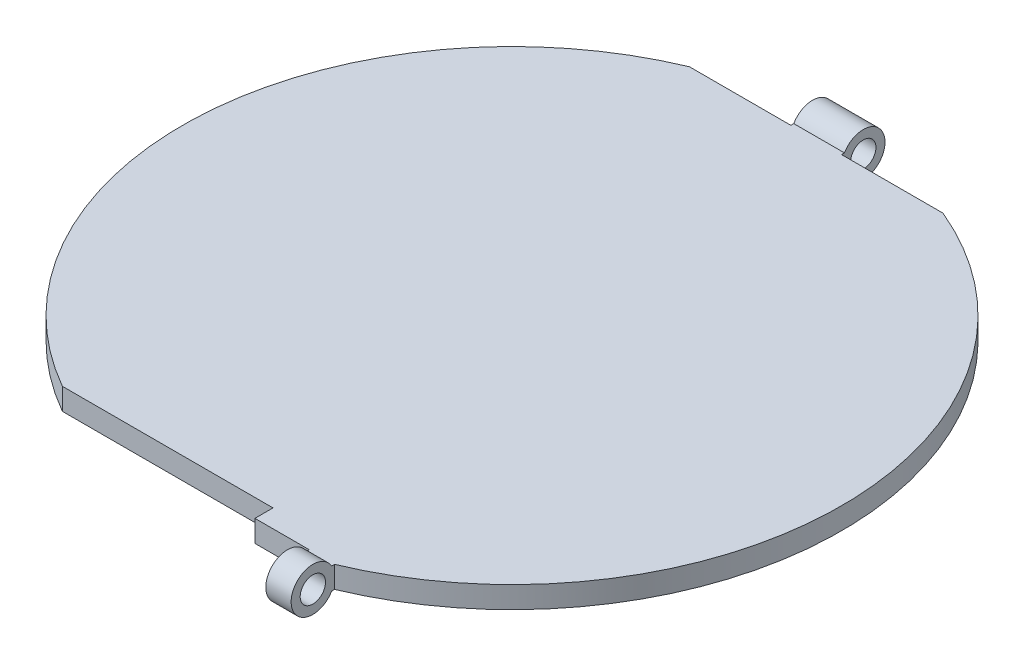
ISO-10303-21;
HEADER;
FILE_DESCRIPTION(('STEP AP214'),'2;1');
FILE_NAME('part.step','',(''),(''),'','','');
FILE_SCHEMA(('AUTOMOTIVE_DESIGN { 1 0 10303 214 1 1 1 1 }'));
ENDSEC;
DATA;
#1=APPLICATION_CONTEXT('core data for automotive mechanical design processes');
#2=APPLICATION_PROTOCOL_DEFINITION('international standard','automotive_design',2000,#1);
#3=PRODUCT_CONTEXT('',#1,'mechanical');
#4=PRODUCT('Part','Part','',(#3));
#5=PRODUCT_RELATED_PRODUCT_CATEGORY('part','',(#4));
#6=PRODUCT_DEFINITION_FORMATION('','',#4);
#7=PRODUCT_DEFINITION_CONTEXT('part definition',#1,'design');
#8=PRODUCT_DEFINITION('design','',#6,#7);
#9=PRODUCT_DEFINITION_SHAPE('','',#8);
#10=(LENGTH_UNIT() NAMED_UNIT(*) SI_UNIT(.MILLI.,.METRE.));
#11=(NAMED_UNIT(*) PLANE_ANGLE_UNIT() SI_UNIT($,.RADIAN.));
#12=(NAMED_UNIT(*) SI_UNIT($,.STERADIAN.) SOLID_ANGLE_UNIT());
#13=UNCERTAINTY_MEASURE_WITH_UNIT(LENGTH_MEASURE(1.E-05),#10,'distance_accuracy_value','');
#14=(GEOMETRIC_REPRESENTATION_CONTEXT(3) GLOBAL_UNCERTAINTY_ASSIGNED_CONTEXT((#13)) GLOBAL_UNIT_ASSIGNED_CONTEXT((#10,
#11,#12)) REPRESENTATION_CONTEXT('',''));
#15=CARTESIAN_POINT('',(0.,0.,0.));
#16=DIRECTION('',(0.,0.,1.));
#17=DIRECTION('',(1.,0.,0.));
#18=AXIS2_PLACEMENT_3D('',#15,#16,#17);
#19=CARTESIAN_POINT('',(0.,3.,0.));
#20=DIRECTION('',(0.,-1.,0.));
#21=DIRECTION('',(0.,0.,-1.));
#22=AXIS2_PLACEMENT_3D('',#19,#20,#21);
#23=CYLINDRICAL_SURFACE('',#22,45.5);
#24=DIRECTION('',(0.,-1.,0.));
#25=VECTOR('',#24,1.);
#26=CARTESIAN_POINT('',(-22.5831795812724,3.,39.5));
#27=LINE('',#26,#25);
#28=CARTESIAN_POINT('',(-22.5831795812724,0.,39.5));
#29=VERTEX_POINT('',#28);
#30=CARTESIAN_POINT('',(-22.5831795812724,3.,39.5));
#31=VERTEX_POINT('',#30);
#32=EDGE_CURVE('E51',#29,#31,#27,.F.);
#33=ORIENTED_EDGE('',*,*,#32,.T.);
#34=CARTESIAN_POINT('',(0.,3.,0.));
#35=DIRECTION('',(0.,1.,0.));
#36=DIRECTION('',(0.,0.,1.));
#37=AXIS2_PLACEMENT_3D('',#34,#35,#36);
#38=CIRCLE('',#37,45.5);
#39=CARTESIAN_POINT('',(-17.5,3.,-42.));
#40=VERTEX_POINT('',#39);
#41=EDGE_CURVE('E143',#40,#31,#38,.T.);
#42=ORIENTED_EDGE('',*,*,#41,.F.);
#43=DIRECTION('',(0.,-1.,0.));
#44=VECTOR('',#43,1.);
#45=CARTESIAN_POINT('',(-17.5,3.,-42.));
#46=LINE('',#45,#44);
#47=CARTESIAN_POINT('',(-17.5,0.,-42.));
#48=VERTEX_POINT('',#47);
#49=EDGE_CURVE('E164',#40,#48,#46,.T.);
#50=ORIENTED_EDGE('',*,*,#49,.T.);
#51=CARTESIAN_POINT('',(0.,0.,0.));
#52=DIRECTION('',(0.,1.,0.));
#53=DIRECTION('',(0.,0.,1.));
#54=AXIS2_PLACEMENT_3D('',#51,#52,#53);
#55=CIRCLE('',#54,45.5);
#56=EDGE_CURVE('E145',#48,#29,#55,.T.);
#57=ORIENTED_EDGE('',*,*,#56,.T.);
#58=EDGE_LOOP('',(#33,#42,#50,#57));
#59=FACE_BOUND('',#58,.T.);
#60=ADVANCED_FACE('F37',(#59),#23,.T.);
#61=CARTESIAN_POINT('',(-17.5,3.,42.));
#62=DIRECTION('',(0.,0.,-1.));
#63=DIRECTION('',(-1.,0.,0.));
#64=AXIS2_PLACEMENT_3D('',#61,#62,#63);
#65=PLANE('',#64);
#66=DIRECTION('',(0.,1.,0.));
#67=VECTOR('',#66,1.);
#68=CARTESIAN_POINT('',(6.5,3.,42.));
#69=LINE('',#68,#67);
#70=CARTESIAN_POINT('',(6.5,0.,42.));
#71=VERTEX_POINT('',#70);
#72=CARTESIAN_POINT('',(6.5,3.,42.));
#73=VERTEX_POINT('',#72);
#74=EDGE_CURVE('E137',#71,#73,#69,.T.);
#75=ORIENTED_EDGE('',*,*,#74,.F.);
#76=DIRECTION('',(1.,0.,0.));
#77=VECTOR('',#76,1.);
#78=CARTESIAN_POINT('',(-17.5,0.,42.));
#79=LINE('',#78,#77);
#80=CARTESIAN_POINT('',(14.,0.,42.));
#81=VERTEX_POINT('',#80);
#82=EDGE_CURVE('E166',#71,#81,#79,.T.);
#83=ORIENTED_EDGE('',*,*,#82,.T.);
#84=DIRECTION('',(0.,-1.,0.));
#85=VECTOR('',#84,1.);
#86=CARTESIAN_POINT('',(14.,6.5,42.));
#87=LINE('',#86,#85);
#88=CARTESIAN_POINT('',(14.,3.,42.));
#89=VERTEX_POINT('',#88);
#90=EDGE_CURVE('E182',#89,#81,#87,.T.);
#91=ORIENTED_EDGE('',*,*,#90,.F.);
#92=DIRECTION('',(1.,0.,0.));
#93=VECTOR('',#92,1.);
#94=CARTESIAN_POINT('',(-17.5,3.,42.));
#95=LINE('',#94,#93);
#96=EDGE_CURVE('E150',#73,#89,#95,.T.);
#97=ORIENTED_EDGE('',*,*,#96,.F.);
#98=EDGE_LOOP('',(#75,#83,#91,#97));
#99=FACE_BOUND('',#98,.T.);
#100=ADVANCED_FACE('F203',(#99),#65,.F.);
#101=CARTESIAN_POINT('',(0.,3.,0.));
#102=DIRECTION('',(0.,1.,0.));
#103=DIRECTION('',(0.,0.,1.));
#104=AXIS2_PLACEMENT_3D('',#101,#102,#103);
#105=PLANE('',#104);
#106=DIRECTION('',(1.,0.,0.));
#107=VECTOR('',#106,1.);
#108=CARTESIAN_POINT('',(0.,3.,39.5));
#109=LINE('',#108,#107);
#110=CARTESIAN_POINT('',(6.5,3.,39.5));
#111=VERTEX_POINT('',#110);
#112=EDGE_CURVE('E130',#31,#111,#109,.T.);
#113=ORIENTED_EDGE('',*,*,#112,.T.);
#114=DIRECTION('',(0.,0.,1.));
#115=VECTOR('',#114,1.);
#116=CARTESIAN_POINT('',(6.5,3.,0.));
#117=LINE('',#116,#115);
#118=EDGE_CURVE('E193',#111,#73,#117,.T.);
#119=ORIENTED_EDGE('',*,*,#118,.T.);
#120=ORIENTED_EDGE('',*,*,#96,.T.);
#121=DIRECTION('',(0.,0.,1.));
#122=VECTOR('',#121,1.);
#123=CARTESIAN_POINT('',(14.,3.,0.));
#124=LINE('',#123,#122);
#125=CARTESIAN_POINT('',(14.,3.,42.4019237886467));
#126=VERTEX_POINT('',#125);
#127=EDGE_CURVE('E211',#89,#126,#124,.T.);
#128=ORIENTED_EDGE('',*,*,#127,.T.);
#129=DIRECTION('',(1.,0.,0.));
#130=VECTOR('',#129,1.);
#131=CARTESIAN_POINT('',(-10.,3.,42.4019237886467));
#132=LINE('',#131,#130);
#133=CARTESIAN_POINT('',(17.5,3.,42.4019237886467));
#134=VERTEX_POINT('',#133);
#135=EDGE_CURVE('E158',#126,#134,#132,.T.);
#136=ORIENTED_EDGE('',*,*,#135,.T.);
#137=DIRECTION('',(0.,0.,1.));
#138=VECTOR('',#137,1.);
#139=CARTESIAN_POINT('',(17.5,3.,42.));
#140=LINE('',#139,#138);
#141=CARTESIAN_POINT('',(17.5,3.,42.));
#142=VERTEX_POINT('',#141);
#143=EDGE_CURVE('E229',#142,#134,#140,.T.);
#144=ORIENTED_EDGE('',*,*,#143,.F.);
#145=CARTESIAN_POINT('',(0.,3.,0.));
#146=DIRECTION('',(0.,1.,0.));
#147=DIRECTION('',(0.,0.,1.));
#148=AXIS2_PLACEMENT_3D('',#145,#146,#147);
#149=CIRCLE('',#148,45.5);
#150=CARTESIAN_POINT('',(17.5,3.,-42.));
#151=VERTEX_POINT('',#150);
#152=EDGE_CURVE('E153',#142,#151,#149,.T.);
#153=ORIENTED_EDGE('',*,*,#152,.T.);
#154=DIRECTION('',(1.,0.,0.));
#155=VECTOR('',#154,1.);
#156=CARTESIAN_POINT('',(0.,3.,-42.));
#157=LINE('',#156,#155);
#158=CARTESIAN_POINT('',(3.5,3.,-42.));
#159=VERTEX_POINT('',#158);
#160=EDGE_CURVE('E468',#159,#151,#157,.T.);
#161=ORIENTED_EDGE('',*,*,#160,.F.);
#162=DIRECTION('',(0.,0.,-1.));
#163=VECTOR('',#162,1.);
#164=CARTESIAN_POINT('',(3.5,3.,0.));
#165=LINE('',#164,#163);
#166=CARTESIAN_POINT('',(3.5,3.,-42.4019237886467));
#167=VERTEX_POINT('',#166);
#168=EDGE_CURVE('E457',#159,#167,#165,.T.);
#169=ORIENTED_EDGE('',*,*,#168,.T.);
#170=DIRECTION('',(1.,0.,0.));
#171=VECTOR('',#170,1.);
#172=CARTESIAN_POINT('',(-10.,3.,-42.4019237886467));
#173=LINE('',#172,#171);
#174=CARTESIAN_POINT('',(-3.5,3.,-42.4019237886467));
#175=VERTEX_POINT('',#174);
#176=EDGE_CURVE('E221',#175,#167,#173,.T.);
#177=ORIENTED_EDGE('',*,*,#176,.F.);
#178=DIRECTION('',(0.,0.,1.));
#179=VECTOR('',#178,1.);
#180=CARTESIAN_POINT('',(-3.5,3.,0.));
#181=LINE('',#180,#179);
#182=CARTESIAN_POINT('',(-3.5,3.,-42.));
#183=VERTEX_POINT('',#182);
#184=EDGE_CURVE('E59',#175,#183,#181,.T.);
#185=ORIENTED_EDGE('',*,*,#184,.T.);
#186=DIRECTION('',(-1.,0.,0.));
#187=VECTOR('',#186,1.);
#188=CARTESIAN_POINT('',(-17.5,3.,-42.));
#189=LINE('',#188,#187);
#190=EDGE_CURVE('E148',#183,#40,#189,.T.);
#191=ORIENTED_EDGE('',*,*,#190,.T.);
#192=ORIENTED_EDGE('',*,*,#41,.T.);
#193=EDGE_LOOP('',(#113,#119,#120,#128,#136,#144,#153,#161,#169,#177,#185,#191,#192));
#194=FACE_BOUND('',#193,.T.);
#195=ADVANCED_FACE('F147',(#194),#105,.T.);
#196=CARTESIAN_POINT('',(0.,0.,0.));
#197=DIRECTION('',(0.,1.,0.));
#198=DIRECTION('',(0.,0.,1.));
#199=AXIS2_PLACEMENT_3D('',#196,#197,#198);
#200=PLANE('',#199);
#201=DIRECTION('',(0.,0.,1.));
#202=VECTOR('',#201,1.);
#203=CARTESIAN_POINT('',(6.5,0.,0.));
#204=LINE('',#203,#202);
#205=CARTESIAN_POINT('',(6.5,0.,39.5));
#206=VERTEX_POINT('',#205);
#207=EDGE_CURVE('E11',#206,#71,#204,.T.);
#208=ORIENTED_EDGE('',*,*,#207,.F.);
#209=DIRECTION('',(1.,0.,0.));
#210=VECTOR('',#209,1.);
#211=CARTESIAN_POINT('',(0.,0.,39.5));
#212=LINE('',#211,#210);
#213=EDGE_CURVE('E44',#29,#206,#212,.T.);
#214=ORIENTED_EDGE('',*,*,#213,.F.);
#215=ORIENTED_EDGE('',*,*,#56,.F.);
#216=DIRECTION('',(-1.,0.,0.));
#217=VECTOR('',#216,1.);
#218=CARTESIAN_POINT('',(-17.5,0.,-42.));
#219=LINE('',#218,#217);
#220=CARTESIAN_POINT('',(-3.5,0.,-42.));
#221=VERTEX_POINT('',#220);
#222=EDGE_CURVE('E151',#221,#48,#219,.T.);
#223=ORIENTED_EDGE('',*,*,#222,.F.);
#224=DIRECTION('',(0.,0.,1.));
#225=VECTOR('',#224,1.);
#226=CARTESIAN_POINT('',(-3.5,0.,0.));
#227=LINE('',#226,#225);
#228=CARTESIAN_POINT('',(-3.5,0.,-42.4019237886467));
#229=VERTEX_POINT('',#228);
#230=EDGE_CURVE('E213',#229,#221,#227,.T.);
#231=ORIENTED_EDGE('',*,*,#230,.F.);
#232=DIRECTION('',(1.,0.,0.));
#233=VECTOR('',#232,1.);
#234=CARTESIAN_POINT('',(-10.,0.,-42.4019237886467));
#235=LINE('',#234,#233);
#236=CARTESIAN_POINT('',(3.5,0.,-42.4019237886467));
#237=VERTEX_POINT('',#236);
#238=EDGE_CURVE('E220',#229,#237,#235,.T.);
#239=ORIENTED_EDGE('',*,*,#238,.T.);
#240=DIRECTION('',(0.,0.,-1.));
#241=VECTOR('',#240,1.);
#242=CARTESIAN_POINT('',(3.5,0.,0.));
#243=LINE('',#242,#241);
#244=CARTESIAN_POINT('',(3.5,0.,-42.));
#245=VERTEX_POINT('',#244);
#246=EDGE_CURVE('E177',#245,#237,#243,.T.);
#247=ORIENTED_EDGE('',*,*,#246,.F.);
#248=DIRECTION('',(1.,0.,0.));
#249=VECTOR('',#248,1.);
#250=CARTESIAN_POINT('',(0.,0.,-42.));
#251=LINE('',#250,#249);
#252=CARTESIAN_POINT('',(17.5,0.,-42.));
#253=VERTEX_POINT('',#252);
#254=EDGE_CURVE('E459',#245,#253,#251,.T.);
#255=ORIENTED_EDGE('',*,*,#254,.T.);
#256=CARTESIAN_POINT('',(0.,0.,0.));
#257=DIRECTION('',(0.,1.,0.));
#258=DIRECTION('',(0.,0.,1.));
#259=AXIS2_PLACEMENT_3D('',#256,#257,#258);
#260=CIRCLE('',#259,45.5);
#261=CARTESIAN_POINT('',(17.5,0.,42.));
#262=VERTEX_POINT('',#261);
#263=EDGE_CURVE('E155',#262,#253,#260,.T.);
#264=ORIENTED_EDGE('',*,*,#263,.F.);
#265=DIRECTION('',(0.,0.,-1.));
#266=VECTOR('',#265,1.);
#267=CARTESIAN_POINT('',(17.5,0.,42.));
#268=LINE('',#267,#266);
#269=CARTESIAN_POINT('',(17.5,0.,42.4019237886467));
#270=VERTEX_POINT('',#269);
#271=EDGE_CURVE('E235',#270,#262,#268,.T.);
#272=ORIENTED_EDGE('',*,*,#271,.F.);
#273=DIRECTION('',(1.,0.,0.));
#274=VECTOR('',#273,1.);
#275=CARTESIAN_POINT('',(-10.,0.,42.4019237886467));
#276=LINE('',#275,#274);
#277=CARTESIAN_POINT('',(14.,0.,42.4019237886467));
#278=VERTEX_POINT('',#277);
#279=EDGE_CURVE('E167',#278,#270,#276,.T.);
#280=ORIENTED_EDGE('',*,*,#279,.F.);
#281=DIRECTION('',(0.,0.,1.));
#282=VECTOR('',#281,1.);
#283=CARTESIAN_POINT('',(14.,0.,0.));
#284=LINE('',#283,#282);
#285=EDGE_CURVE('E199',#81,#278,#284,.T.);
#286=ORIENTED_EDGE('',*,*,#285,.F.);
#287=ORIENTED_EDGE('',*,*,#82,.F.);
#288=EDGE_LOOP('',(#208,#214,#215,#223,#231,#239,#247,#255,#264,#272,#280,#286,#287));
#289=FACE_BOUND('',#288,.T.);
#290=ADVANCED_FACE('F196',(#289),#200,.F.);
#291=CARTESIAN_POINT('',(-10.,1.5,-45.));
#292=DIRECTION('',(1.,0.,0.));
#293=DIRECTION('',(0.,0.,-1.));
#294=AXIS2_PLACEMENT_3D('',#291,#292,#293);
#295=CYLINDRICAL_SURFACE('',#294,3.);
#296=CARTESIAN_POINT('',(3.5,1.5,-45.));
#297=DIRECTION('',(1.,0.,0.));
#298=DIRECTION('',(0.,0.,-1.));
#299=AXIS2_PLACEMENT_3D('',#296,#297,#298);
#300=CIRCLE('',#299,3.);
#301=EDGE_CURVE('E467',#237,#167,#300,.T.);
#302=ORIENTED_EDGE('',*,*,#301,.F.);
#303=ORIENTED_EDGE('',*,*,#238,.F.);
#304=CARTESIAN_POINT('',(-3.5,1.5,-45.));
#305=DIRECTION('',(-1.,0.,0.));
#306=DIRECTION('',(0.,0.,1.));
#307=AXIS2_PLACEMENT_3D('',#304,#305,#306);
#308=CIRCLE('',#307,3.);
#309=EDGE_CURVE('E186',#175,#229,#308,.T.);
#310=ORIENTED_EDGE('',*,*,#309,.F.);
#311=ORIENTED_EDGE('',*,*,#176,.T.);
#312=EDGE_LOOP('',(#302,#303,#310,#311));
#313=FACE_BOUND('',#312,.T.);
#314=ADVANCED_FACE('F257',(#313),#295,.T.);
#315=CARTESIAN_POINT('',(-10.,1.5,-45.));
#316=DIRECTION('',(1.,0.,0.));
#317=DIRECTION('',(0.,0.,-1.));
#318=AXIS2_PLACEMENT_3D('',#315,#316,#317);
#319=CYLINDRICAL_SURFACE('',#318,1.75);
#320=CARTESIAN_POINT('',(-3.5,1.5,-45.));
#321=DIRECTION('',(-1.,0.,0.));
#322=DIRECTION('',(0.,0.,1.));
#323=AXIS2_PLACEMENT_3D('',#320,#321,#322);
#324=CIRCLE('',#323,1.75);
#325=CARTESIAN_POINT('',(-3.5,1.5,-43.25));
#326=VERTEX_POINT('',#325);
#327=EDGE_CURVE('E183',#326,#326,#324,.T.);
#328=ORIENTED_EDGE('',*,*,#327,.T.);
#329=EDGE_LOOP('',(#328));
#330=FACE_BOUND('',#329,.T.);
#331=CARTESIAN_POINT('',(3.5,1.5,-45.));
#332=DIRECTION('',(1.,0.,0.));
#333=DIRECTION('',(0.,0.,-1.));
#334=AXIS2_PLACEMENT_3D('',#331,#332,#333);
#335=CIRCLE('',#334,1.75);
#336=CARTESIAN_POINT('',(3.5,1.5,-46.75));
#337=VERTEX_POINT('',#336);
#338=EDGE_CURVE('E451',#337,#337,#335,.T.);
#339=ORIENTED_EDGE('',*,*,#338,.T.);
#340=EDGE_LOOP('',(#339));
#341=FACE_BOUND('',#340,.T.);
#342=ADVANCED_FACE('F248',(#330,#341),#319,.F.);
#343=CARTESIAN_POINT('',(-10.,1.5,45.));
#344=DIRECTION('',(1.,0.,0.));
#345=DIRECTION('',(0.,0.,-1.));
#346=AXIS2_PLACEMENT_3D('',#343,#344,#345);
#347=CYLINDRICAL_SURFACE('',#346,3.);
#348=ORIENTED_EDGE('',*,*,#135,.F.);
#349=CARTESIAN_POINT('',(14.,1.5,45.));
#350=DIRECTION('',(-1.,0.,0.));
#351=DIRECTION('',(0.,0.,1.));
#352=AXIS2_PLACEMENT_3D('',#349,#350,#351);
#353=CIRCLE('',#352,3.);
#354=EDGE_CURVE('E181',#126,#278,#353,.F.);
#355=ORIENTED_EDGE('',*,*,#354,.T.);
#356=ORIENTED_EDGE('',*,*,#279,.T.);
#357=CARTESIAN_POINT('',(17.5,1.5,45.));
#358=DIRECTION('',(1.,0.,0.));
#359=DIRECTION('',(0.,0.,-1.));
#360=AXIS2_PLACEMENT_3D('',#357,#358,#359);
#361=CIRCLE('',#360,3.);
#362=EDGE_CURVE('E232',#134,#270,#361,.T.);
#363=ORIENTED_EDGE('',*,*,#362,.F.);
#364=EDGE_LOOP('',(#348,#355,#356,#363));
#365=FACE_BOUND('',#364,.T.);
#366=ADVANCED_FACE('F245',(#365),#347,.T.);
#367=CARTESIAN_POINT('',(-10.,1.5,45.));
#368=DIRECTION('',(1.,0.,0.));
#369=DIRECTION('',(0.,0.,-1.));
#370=AXIS2_PLACEMENT_3D('',#367,#368,#369);
#371=CYLINDRICAL_SURFACE('',#370,1.75);
#372=CARTESIAN_POINT('',(17.5,1.5,45.));
#373=DIRECTION('',(1.,0.,0.));
#374=DIRECTION('',(0.,0.,-1.));
#375=AXIS2_PLACEMENT_3D('',#372,#373,#374);
#376=CIRCLE('',#375,1.75);
#377=CARTESIAN_POINT('',(17.5,1.5,43.25));
#378=VERTEX_POINT('',#377);
#379=EDGE_CURVE('E224',#378,#378,#376,.T.);
#380=ORIENTED_EDGE('',*,*,#379,.T.);
#381=EDGE_LOOP('',(#380));
#382=FACE_BOUND('',#381,.T.);
#383=CARTESIAN_POINT('',(14.,1.5,45.));
#384=DIRECTION('',(-1.,0.,0.));
#385=DIRECTION('',(0.,0.,1.));
#386=AXIS2_PLACEMENT_3D('',#383,#384,#385);
#387=CIRCLE('',#386,1.75);
#388=CARTESIAN_POINT('',(14.,1.5,46.75));
#389=VERTEX_POINT('',#388);
#390=EDGE_CURVE('E178',#389,#389,#387,.F.);
#391=ORIENTED_EDGE('',*,*,#390,.F.);
#392=EDGE_LOOP('',(#391));
#393=FACE_BOUND('',#392,.T.);
#394=ADVANCED_FACE('F247',(#382,#393),#371,.F.);
#395=CARTESIAN_POINT('',(-17.5,3.,-42.));
#396=DIRECTION('',(0.,0.,1.));
#397=DIRECTION('',(1.,0.,0.));
#398=AXIS2_PLACEMENT_3D('',#395,#396,#397);
#399=PLANE('',#398);
#400=ORIENTED_EDGE('',*,*,#190,.F.);
#401=DIRECTION('',(0.,1.,0.));
#402=VECTOR('',#401,1.);
#403=CARTESIAN_POINT('',(-3.5,-2.5,-42.));
#404=LINE('',#403,#402);
#405=EDGE_CURVE('E187',#221,#183,#404,.T.);
#406=ORIENTED_EDGE('',*,*,#405,.F.);
#407=ORIENTED_EDGE('',*,*,#222,.T.);
#408=ORIENTED_EDGE('',*,*,#49,.F.);
#409=EDGE_LOOP('',(#400,#406,#407,#408));
#410=FACE_BOUND('',#409,.T.);
#411=ADVANCED_FACE('F254',(#410),#399,.F.);
#412=CARTESIAN_POINT('',(0.,3.,0.));
#413=DIRECTION('',(0.,-1.,0.));
#414=DIRECTION('',(0.,0.,-1.));
#415=AXIS2_PLACEMENT_3D('',#412,#413,#414);
#416=CYLINDRICAL_SURFACE('',#415,45.5);
#417=ORIENTED_EDGE('',*,*,#263,.T.);
#418=DIRECTION('',(0.,-1.,0.));
#419=VECTOR('',#418,1.);
#420=CARTESIAN_POINT('',(17.5,3.,-42.));
#421=LINE('',#420,#419);
#422=EDGE_CURVE('E172',#151,#253,#421,.T.);
#423=ORIENTED_EDGE('',*,*,#422,.F.);
#424=ORIENTED_EDGE('',*,*,#152,.F.);
#425=DIRECTION('',(0.,-1.,0.));
#426=VECTOR('',#425,1.);
#427=CARTESIAN_POINT('',(17.5,3.,42.));
#428=LINE('',#427,#426);
#429=EDGE_CURVE('E174',#142,#262,#428,.T.);
#430=ORIENTED_EDGE('',*,*,#429,.T.);
#431=EDGE_LOOP('',(#417,#423,#424,#430));
#432=FACE_BOUND('',#431,.T.);
#433=ADVANCED_FACE('F271',(#432),#416,.T.);
#434=CARTESIAN_POINT('',(17.5,1.5,45.));
#435=DIRECTION('',(1.,0.,0.));
#436=DIRECTION('',(0.,0.,-1.));
#437=AXIS2_PLACEMENT_3D('',#434,#435,#436);
#438=PLANE('',#437);
#439=ORIENTED_EDGE('',*,*,#429,.F.);
#440=ORIENTED_EDGE('',*,*,#143,.T.);
#441=ORIENTED_EDGE('',*,*,#362,.T.);
#442=ORIENTED_EDGE('',*,*,#271,.T.);
#443=EDGE_LOOP('',(#439,#440,#441,#442));
#444=FACE_BOUND('',#443,.T.);
#445=ORIENTED_EDGE('',*,*,#379,.F.);
#446=EDGE_LOOP('',(#445));
#447=FACE_BOUND('',#446,.T.);
#448=ADVANCED_FACE('F242',(#444,#447),#438,.T.);
#449=CARTESIAN_POINT('',(14.,0.,0.));
#450=DIRECTION('',(-1.,0.,0.));
#451=DIRECTION('',(0.,0.,1.));
#452=AXIS2_PLACEMENT_3D('',#449,#450,#451);
#453=PLANE('',#452);
#454=ORIENTED_EDGE('',*,*,#90,.T.);
#455=ORIENTED_EDGE('',*,*,#285,.T.);
#456=ORIENTED_EDGE('',*,*,#354,.F.);
#457=ORIENTED_EDGE('',*,*,#127,.F.);
#458=EDGE_LOOP('',(#454,#455,#456,#457));
#459=FACE_BOUND('',#458,.T.);
#460=ORIENTED_EDGE('',*,*,#390,.T.);
#461=EDGE_LOOP('',(#460));
#462=FACE_BOUND('',#461,.T.);
#463=ADVANCED_FACE('F207',(#459,#462),#453,.T.);
#464=CARTESIAN_POINT('',(-3.5,0.,0.));
#465=DIRECTION('',(-1.,0.,0.));
#466=DIRECTION('',(0.,0.,1.));
#467=AXIS2_PLACEMENT_3D('',#464,#465,#466);
#468=PLANE('',#467);
#469=ORIENTED_EDGE('',*,*,#309,.T.);
#470=ORIENTED_EDGE('',*,*,#230,.T.);
#471=ORIENTED_EDGE('',*,*,#405,.T.);
#472=ORIENTED_EDGE('',*,*,#184,.F.);
#473=EDGE_LOOP('',(#469,#470,#471,#472));
#474=FACE_BOUND('',#473,.T.);
#475=ORIENTED_EDGE('',*,*,#327,.F.);
#476=EDGE_LOOP('',(#475));
#477=FACE_BOUND('',#476,.T.);
#478=ADVANCED_FACE('F293',(#474,#477),#468,.T.);
#479=CARTESIAN_POINT('',(3.5,5.08958026071778,-42.));
#480=DIRECTION('',(0.,0.,1.));
#481=DIRECTION('',(1.,0.,0.));
#482=AXIS2_PLACEMENT_3D('',#479,#480,#481);
#483=PLANE('',#482);
#484=ORIENTED_EDGE('',*,*,#160,.T.);
#485=ORIENTED_EDGE('',*,*,#422,.T.);
#486=ORIENTED_EDGE('',*,*,#254,.F.);
#487=DIRECTION('',(0.,-1.,0.));
#488=VECTOR('',#487,1.);
#489=CARTESIAN_POINT('',(3.5,5.08958026071778,-42.));
#490=LINE('',#489,#488);
#491=EDGE_CURVE('E454',#159,#245,#490,.T.);
#492=ORIENTED_EDGE('',*,*,#491,.F.);
#493=EDGE_LOOP('',(#484,#485,#486,#492));
#494=FACE_BOUND('',#493,.T.);
#495=ADVANCED_FACE('F297',(#494),#483,.F.);
#496=CARTESIAN_POINT('',(3.5,0.,0.));
#497=DIRECTION('',(1.,0.,0.));
#498=DIRECTION('',(0.,0.,-1.));
#499=AXIS2_PLACEMENT_3D('',#496,#497,#498);
#500=PLANE('',#499);
#501=ORIENTED_EDGE('',*,*,#338,.F.);
#502=EDGE_LOOP('',(#501));
#503=FACE_BOUND('',#502,.T.);
#504=ORIENTED_EDGE('',*,*,#491,.T.);
#505=ORIENTED_EDGE('',*,*,#246,.T.);
#506=ORIENTED_EDGE('',*,*,#301,.T.);
#507=ORIENTED_EDGE('',*,*,#168,.F.);
#508=EDGE_LOOP('',(#504,#505,#506,#507));
#509=FACE_BOUND('',#508,.T.);
#510=ADVANCED_FACE('F302',(#503,#509),#500,.T.);
#511=CARTESIAN_POINT('',(-45.501,7.5,39.5));
#512=DIRECTION('',(0.,0.,1.));
#513=DIRECTION('',(1.,0.,0.));
#514=AXIS2_PLACEMENT_3D('',#511,#512,#513);
#515=PLANE('',#514);
#516=ORIENTED_EDGE('',*,*,#32,.F.);
#517=ORIENTED_EDGE('',*,*,#213,.T.);
#518=DIRECTION('',(0.,-1.,0.));
#519=VECTOR('',#518,1.);
#520=CARTESIAN_POINT('',(6.5,7.5,39.5));
#521=LINE('',#520,#519);
#522=EDGE_CURVE('E133',#111,#206,#521,.T.);
#523=ORIENTED_EDGE('',*,*,#522,.F.);
#524=ORIENTED_EDGE('',*,*,#112,.F.);
#525=EDGE_LOOP('',(#516,#517,#523,#524));
#526=FACE_BOUND('',#525,.T.);
#527=ADVANCED_FACE('F131',(#526),#515,.T.);
#528=CARTESIAN_POINT('',(6.5,0.,0.));
#529=DIRECTION('',(-1.,0.,0.));
#530=DIRECTION('',(0.,0.,1.));
#531=AXIS2_PLACEMENT_3D('',#528,#529,#530);
#532=PLANE('',#531);
#533=ORIENTED_EDGE('',*,*,#522,.T.);
#534=ORIENTED_EDGE('',*,*,#207,.T.);
#535=ORIENTED_EDGE('',*,*,#74,.T.);
#536=ORIENTED_EDGE('',*,*,#118,.F.);
#537=EDGE_LOOP('',(#533,#534,#535,#536));
#538=FACE_BOUND('',#537,.T.);
#539=ADVANCED_FACE('F191',(#538),#532,.T.);
#540=CLOSED_SHELL('',(#60,#100,#195,#290,#314,#342,#366,#394,#411,#433,#448,#463,#478,#495,#510,
#527,#539));
#541=MANIFOLD_SOLID_BREP('B2',#540);
#542=ADVANCED_BREP_SHAPE_REPRESENTATION('',(#18,#541),#14);
#543=SHAPE_DEFINITION_REPRESENTATION(#9,#542);
ENDSEC;
END-ISO-10303-21;
